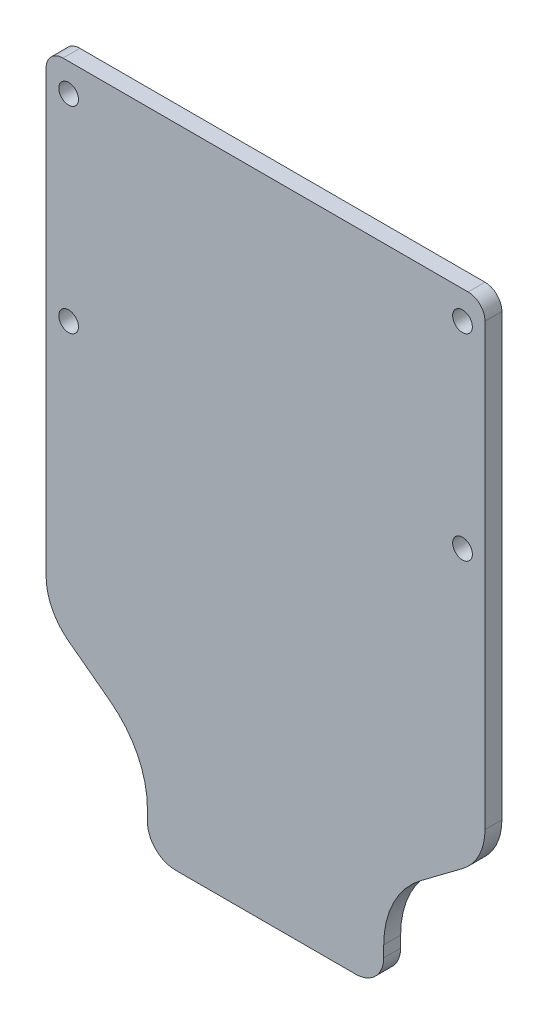
ISO-10303-21;
HEADER;
FILE_DESCRIPTION(('STEP AP214'),'2;1');
FILE_NAME('part.step','',(''),(''),'','','');
FILE_SCHEMA(('AUTOMOTIVE_DESIGN { 1 0 10303 214 1 1 1 1 }'));
ENDSEC;
DATA;
#1=APPLICATION_CONTEXT('core data for automotive mechanical design processes');
#2=APPLICATION_PROTOCOL_DEFINITION('international standard','automotive_design',2000,#1);
#3=PRODUCT_CONTEXT('',#1,'mechanical');
#4=PRODUCT('Part','Part','',(#3));
#5=PRODUCT_RELATED_PRODUCT_CATEGORY('part','',(#4));
#6=PRODUCT_DEFINITION_FORMATION('','',#4);
#7=PRODUCT_DEFINITION_CONTEXT('part definition',#1,'design');
#8=PRODUCT_DEFINITION('design','',#6,#7);
#9=PRODUCT_DEFINITION_SHAPE('','',#8);
#10=(LENGTH_UNIT() NAMED_UNIT(*) SI_UNIT(.MILLI.,.METRE.));
#11=(NAMED_UNIT(*) PLANE_ANGLE_UNIT() SI_UNIT($,.RADIAN.));
#12=(NAMED_UNIT(*) SI_UNIT($,.STERADIAN.) SOLID_ANGLE_UNIT());
#13=UNCERTAINTY_MEASURE_WITH_UNIT(LENGTH_MEASURE(1.E-05),#10,'distance_accuracy_value','');
#14=(GEOMETRIC_REPRESENTATION_CONTEXT(3) GLOBAL_UNCERTAINTY_ASSIGNED_CONTEXT((#13)) GLOBAL_UNIT_ASSIGNED_CONTEXT((#10,
#11,#12)) REPRESENTATION_CONTEXT('',''));
#15=CARTESIAN_POINT('',(0.,0.,0.));
#16=DIRECTION('',(0.,0.,1.));
#17=DIRECTION('',(1.,0.,0.));
#18=AXIS2_PLACEMENT_3D('',#15,#16,#17);
#19=CARTESIAN_POINT('',(0.,0.,3.));
#20=DIRECTION('',(0.,0.,1.));
#21=DIRECTION('',(1.,0.,0.));
#22=AXIS2_PLACEMENT_3D('',#19,#20,#21);
#23=PLANE('',#22);
#24=DIRECTION('',(0.,1.,0.));
#25=VECTOR('',#24,1.);
#26=CARTESIAN_POINT('',(39.,-22.5,3.));
#27=LINE('',#26,#25);
#28=CARTESIAN_POINT('',(39.,-58.7499999999953,3.));
#29=VERTEX_POINT('',#28);
#30=CARTESIAN_POINT('',(39.,19.5,3.));
#31=VERTEX_POINT('',#30);
#32=EDGE_CURVE('E241',#29,#31,#27,.T.);
#33=ORIENTED_EDGE('',*,*,#32,.T.);
#34=CARTESIAN_POINT('',(36.,19.5,3.));
#35=DIRECTION('',(0.,0.,1.));
#36=DIRECTION('',(1.,0.,0.));
#37=AXIS2_PLACEMENT_3D('',#34,#35,#36);
#38=CIRCLE('',#37,3.);
#39=CARTESIAN_POINT('',(36.,22.5,3.));
#40=VERTEX_POINT('',#39);
#41=EDGE_CURVE('E50',#31,#40,#38,.T.);
#42=ORIENTED_EDGE('',*,*,#41,.T.);
#43=DIRECTION('',(-1.,0.,0.));
#44=VECTOR('',#43,1.);
#45=CARTESIAN_POINT('',(39.,22.5,3.));
#46=LINE('',#45,#44);
#47=CARTESIAN_POINT('',(-36.,22.5,3.));
#48=VERTEX_POINT('',#47);
#49=EDGE_CURVE('E249',#40,#48,#46,.T.);
#50=ORIENTED_EDGE('',*,*,#49,.T.);
#51=CARTESIAN_POINT('',(-36.,19.5,3.));
#52=DIRECTION('',(0.,0.,1.));
#53=DIRECTION('',(1.,0.,0.));
#54=AXIS2_PLACEMENT_3D('',#51,#52,#53);
#55=CIRCLE('',#54,3.);
#56=CARTESIAN_POINT('',(-39.,19.5,3.));
#57=VERTEX_POINT('',#56);
#58=EDGE_CURVE('E53',#48,#57,#55,.T.);
#59=ORIENTED_EDGE('',*,*,#58,.T.);
#60=DIRECTION('',(0.,-1.,0.));
#61=VECTOR('',#60,1.);
#62=CARTESIAN_POINT('',(-39.,-22.5,3.));
#63=LINE('',#62,#61);
#64=CARTESIAN_POINT('',(-39.,-58.749999999995,3.));
#65=VERTEX_POINT('',#64);
#66=EDGE_CURVE('E242',#57,#65,#63,.T.);
#67=ORIENTED_EDGE('',*,*,#66,.T.);
#68=CARTESIAN_POINT('',(-29.,-58.749999999995,3.));
#69=DIRECTION('',(0.,0.,1.));
#70=DIRECTION('',(1.,0.,0.));
#71=AXIS2_PLACEMENT_3D('',#68,#69,#70);
#72=CIRCLE('',#71,10.);
#73=CARTESIAN_POINT('',(-35.,-66.749999999995,3.));
#74=VERTEX_POINT('',#73);
#75=EDGE_CURVE('E284',#65,#74,#72,.T.);
#76=ORIENTED_EDGE('',*,*,#75,.T.);
#77=DIRECTION('',(-0.799999999999999,0.600000000000001,0.));
#78=VECTOR('',#77,1.);
#79=CARTESIAN_POINT('',(-35.6,-66.299999999995,3.));
#80=LINE('',#79,#78);
#81=CARTESIAN_POINT('',(-27.6,-72.299999999995,3.));
#82=VERTEX_POINT('',#81);
#83=EDGE_CURVE('E170',#82,#74,#80,.T.);
#84=ORIENTED_EDGE('',*,*,#83,.F.);
#85=CARTESIAN_POINT('',(-37.5,-85.499999999995,3.));
#86=DIRECTION('',(0.,0.,1.));
#87=DIRECTION('',(1.,0.,0.));
#88=AXIS2_PLACEMENT_3D('',#85,#86,#87);
#89=CIRCLE('',#88,16.5);
#90=CARTESIAN_POINT('',(-21.,-85.4999999999951,3.));
#91=VERTEX_POINT('',#90);
#92=EDGE_CURVE('E203',#91,#82,#89,.T.);
#93=ORIENTED_EDGE('',*,*,#92,.F.);
#94=DIRECTION('',(0.,1.,0.));
#95=VECTOR('',#94,1.);
#96=CARTESIAN_POINT('',(-21.,-85.4999999999951,3.));
#97=LINE('',#96,#95);
#98=CARTESIAN_POINT('',(-21.,-87.5,3.));
#99=VERTEX_POINT('',#98);
#100=EDGE_CURVE('E200',#99,#91,#97,.T.);
#101=ORIENTED_EDGE('',*,*,#100,.F.);
#102=CARTESIAN_POINT('',(-16.,-87.5,3.));
#103=DIRECTION('',(0.,0.,1.));
#104=DIRECTION('',(1.,0.,0.));
#105=AXIS2_PLACEMENT_3D('',#102,#103,#104);
#106=CIRCLE('',#105,5.);
#107=CARTESIAN_POINT('',(-16.,-92.5,3.));
#108=VERTEX_POINT('',#107);
#109=EDGE_CURVE('E266',#99,#108,#106,.T.);
#110=ORIENTED_EDGE('',*,*,#109,.T.);
#111=DIRECTION('',(-1.,0.,0.));
#112=VECTOR('',#111,1.);
#113=CARTESIAN_POINT('',(39.,-92.5,3.));
#114=LINE('',#113,#112);
#115=CARTESIAN_POINT('',(16.,-92.5,3.));
#116=VERTEX_POINT('',#115);
#117=EDGE_CURVE('E214',#116,#108,#114,.T.);
#118=ORIENTED_EDGE('',*,*,#117,.F.);
#119=CARTESIAN_POINT('',(16.,-87.5,3.));
#120=DIRECTION('',(0.,0.,1.));
#121=DIRECTION('',(1.,0.,0.));
#122=AXIS2_PLACEMENT_3D('',#119,#120,#121);
#123=CIRCLE('',#122,5.);
#124=CARTESIAN_POINT('',(21.,-87.5,3.));
#125=VERTEX_POINT('',#124);
#126=EDGE_CURVE('E268',#116,#125,#123,.T.);
#127=ORIENTED_EDGE('',*,*,#126,.T.);
#128=DIRECTION('',(0.,-1.,0.));
#129=VECTOR('',#128,1.);
#130=CARTESIAN_POINT('',(20.9999999999999,-100.999999999995,3.));
#131=LINE('',#130,#129);
#132=CARTESIAN_POINT('',(21.,-85.4999999999952,3.));
#133=VERTEX_POINT('',#132);
#134=EDGE_CURVE('E198',#133,#125,#131,.T.);
#135=ORIENTED_EDGE('',*,*,#134,.F.);
#136=CARTESIAN_POINT('',(37.5,-85.4999999999953,3.));
#137=DIRECTION('',(0.,0.,1.));
#138=DIRECTION('',(1.,0.,0.));
#139=AXIS2_PLACEMENT_3D('',#136,#137,#138);
#140=CIRCLE('',#139,16.5);
#141=CARTESIAN_POINT('',(27.6,-72.2999999999952,3.));
#142=VERTEX_POINT('',#141);
#143=EDGE_CURVE('E191',#142,#133,#140,.T.);
#144=ORIENTED_EDGE('',*,*,#143,.F.);
#145=DIRECTION('',(-0.800000000000001,-0.599999999999998,0.));
#146=VECTOR('',#145,1.);
#147=CARTESIAN_POINT('',(27.6,-72.2999999999952,3.));
#148=LINE('',#147,#146);
#149=CARTESIAN_POINT('',(35.,-66.7499999999953,3.));
#150=VERTEX_POINT('',#149);
#151=EDGE_CURVE('E172',#150,#142,#148,.T.);
#152=ORIENTED_EDGE('',*,*,#151,.F.);
#153=CARTESIAN_POINT('',(29.,-58.7499999999953,3.));
#154=DIRECTION('',(0.,0.,1.));
#155=DIRECTION('',(1.,0.,0.));
#156=AXIS2_PLACEMENT_3D('',#153,#154,#155);
#157=CIRCLE('',#156,10.);
#158=EDGE_CURVE('E285',#150,#29,#157,.T.);
#159=ORIENTED_EDGE('',*,*,#158,.T.);
#160=EDGE_LOOP('',(#33,#42,#50,#59,#67,#76,#84,#93,#101,#110,#118,#127,#135,#144,#152,#159));
#161=FACE_BOUND('',#160,.T.);
#162=CARTESIAN_POINT('',(35.,-17.5,3.));
#163=DIRECTION('',(0.,0.,1.));
#164=DIRECTION('',(1.,0.,0.));
#165=AXIS2_PLACEMENT_3D('',#162,#163,#164);
#166=CIRCLE('',#165,1.75);
#167=CARTESIAN_POINT('',(36.75,-17.5,3.));
#168=VERTEX_POINT('',#167);
#169=EDGE_CURVE('E223',#168,#168,#166,.T.);
#170=ORIENTED_EDGE('',*,*,#169,.F.);
#171=EDGE_LOOP('',(#170));
#172=FACE_BOUND('',#171,.T.);
#173=CARTESIAN_POINT('',(-35.,17.5,3.));
#174=DIRECTION('',(0.,0.,1.));
#175=DIRECTION('',(1.,0.,0.));
#176=AXIS2_PLACEMENT_3D('',#173,#174,#175);
#177=CIRCLE('',#176,1.75);
#178=CARTESIAN_POINT('',(-33.25,17.5,3.));
#179=VERTEX_POINT('',#178);
#180=EDGE_CURVE('E240',#179,#179,#177,.T.);
#181=ORIENTED_EDGE('',*,*,#180,.F.);
#182=EDGE_LOOP('',(#181));
#183=FACE_BOUND('',#182,.T.);
#184=CARTESIAN_POINT('',(35.,17.5,3.));
#185=DIRECTION('',(0.,0.,1.));
#186=DIRECTION('',(1.,0.,0.));
#187=AXIS2_PLACEMENT_3D('',#184,#185,#186);
#188=CIRCLE('',#187,1.75);
#189=CARTESIAN_POINT('',(36.75,17.5,3.));
#190=VERTEX_POINT('',#189);
#191=EDGE_CURVE('E232',#190,#190,#188,.T.);
#192=ORIENTED_EDGE('',*,*,#191,.F.);
#193=EDGE_LOOP('',(#192));
#194=FACE_BOUND('',#193,.T.);
#195=CARTESIAN_POINT('',(-35.,-17.5,3.));
#196=DIRECTION('',(0.,0.,1.));
#197=DIRECTION('',(1.,0.,0.));
#198=AXIS2_PLACEMENT_3D('',#195,#196,#197);
#199=CIRCLE('',#198,1.75);
#200=CARTESIAN_POINT('',(-33.25,-17.5,3.));
#201=VERTEX_POINT('',#200);
#202=EDGE_CURVE('E218',#201,#201,#199,.T.);
#203=ORIENTED_EDGE('',*,*,#202,.F.);
#204=EDGE_LOOP('',(#203));
#205=FACE_BOUND('',#204,.T.);
#206=ADVANCED_FACE('F39',(#161,#172,#183,#194,#205),#23,.T.);
#207=CARTESIAN_POINT('',(0.,0.,0.));
#208=DIRECTION('',(0.,0.,1.));
#209=DIRECTION('',(1.,0.,0.));
#210=AXIS2_PLACEMENT_3D('',#207,#208,#209);
#211=PLANE('',#210);
#212=DIRECTION('',(-1.,0.,0.));
#213=VECTOR('',#212,1.);
#214=CARTESIAN_POINT('',(39.,22.5,0.));
#215=LINE('',#214,#213);
#216=CARTESIAN_POINT('',(36.,22.5,0.));
#217=VERTEX_POINT('',#216);
#218=CARTESIAN_POINT('',(-36.,22.5,0.));
#219=VERTEX_POINT('',#218);
#220=EDGE_CURVE('E247',#217,#219,#215,.T.);
#221=ORIENTED_EDGE('',*,*,#220,.F.);
#222=CARTESIAN_POINT('',(36.,19.5,0.));
#223=DIRECTION('',(0.,0.,1.));
#224=DIRECTION('',(1.,0.,0.));
#225=AXIS2_PLACEMENT_3D('',#222,#223,#224);
#226=CIRCLE('',#225,3.);
#227=CARTESIAN_POINT('',(39.,19.5,0.));
#228=VERTEX_POINT('',#227);
#229=EDGE_CURVE('E297',#217,#228,#226,.F.);
#230=ORIENTED_EDGE('',*,*,#229,.T.);
#231=DIRECTION('',(0.,1.,0.));
#232=VECTOR('',#231,1.);
#233=CARTESIAN_POINT('',(39.,-22.5,0.));
#234=LINE('',#233,#232);
#235=CARTESIAN_POINT('',(39.,-58.7499999999953,0.));
#236=VERTEX_POINT('',#235);
#237=EDGE_CURVE('E252',#236,#228,#234,.T.);
#238=ORIENTED_EDGE('',*,*,#237,.F.);
#239=CARTESIAN_POINT('',(29.,-58.7499999999953,0.));
#240=DIRECTION('',(0.,0.,1.));
#241=DIRECTION('',(1.,0.,0.));
#242=AXIS2_PLACEMENT_3D('',#239,#240,#241);
#243=CIRCLE('',#242,10.);
#244=CARTESIAN_POINT('',(35.,-66.7499999999953,0.));
#245=VERTEX_POINT('',#244);
#246=EDGE_CURVE('E163',#236,#245,#243,.F.);
#247=ORIENTED_EDGE('',*,*,#246,.T.);
#248=DIRECTION('',(-0.800000000000001,-0.599999999999998,0.));
#249=VECTOR('',#248,1.);
#250=CARTESIAN_POINT('',(27.6,-72.2999999999952,0.));
#251=LINE('',#250,#249);
#252=CARTESIAN_POINT('',(27.6,-72.2999999999952,0.));
#253=VERTEX_POINT('',#252);
#254=EDGE_CURVE('E154',#245,#253,#251,.T.);
#255=ORIENTED_EDGE('',*,*,#254,.T.);
#256=CARTESIAN_POINT('',(37.5,-85.4999999999953,0.));
#257=DIRECTION('',(0.,0.,1.));
#258=DIRECTION('',(1.,0.,0.));
#259=AXIS2_PLACEMENT_3D('',#256,#257,#258);
#260=CIRCLE('',#259,16.5);
#261=CARTESIAN_POINT('',(21.,-85.4999999999952,0.));
#262=VERTEX_POINT('',#261);
#263=EDGE_CURVE('E165',#253,#262,#260,.T.);
#264=ORIENTED_EDGE('',*,*,#263,.T.);
#265=DIRECTION('',(0.,-1.,0.));
#266=VECTOR('',#265,1.);
#267=CARTESIAN_POINT('',(20.9999999999999,-100.999999999995,0.));
#268=LINE('',#267,#266);
#269=CARTESIAN_POINT('',(21.,-87.5,0.));
#270=VERTEX_POINT('',#269);
#271=EDGE_CURVE('E185',#262,#270,#268,.T.);
#272=ORIENTED_EDGE('',*,*,#271,.T.);
#273=CARTESIAN_POINT('',(16.,-87.5,0.));
#274=DIRECTION('',(0.,0.,1.));
#275=DIRECTION('',(1.,0.,0.));
#276=AXIS2_PLACEMENT_3D('',#273,#274,#275);
#277=CIRCLE('',#276,5.);
#278=CARTESIAN_POINT('',(16.,-92.5,0.));
#279=VERTEX_POINT('',#278);
#280=EDGE_CURVE('E257',#270,#279,#277,.F.);
#281=ORIENTED_EDGE('',*,*,#280,.T.);
#282=DIRECTION('',(1.,0.,0.));
#283=VECTOR('',#282,1.);
#284=CARTESIAN_POINT('',(-39.,-92.5,0.));
#285=LINE('',#284,#283);
#286=CARTESIAN_POINT('',(-16.,-92.5,0.));
#287=VERTEX_POINT('',#286);
#288=EDGE_CURVE('E208',#287,#279,#285,.T.);
#289=ORIENTED_EDGE('',*,*,#288,.F.);
#290=CARTESIAN_POINT('',(-16.,-87.5,0.));
#291=DIRECTION('',(0.,0.,1.));
#292=DIRECTION('',(1.,0.,0.));
#293=AXIS2_PLACEMENT_3D('',#290,#291,#292);
#294=CIRCLE('',#293,5.);
#295=CARTESIAN_POINT('',(-21.,-87.5,0.));
#296=VERTEX_POINT('',#295);
#297=EDGE_CURVE('E256',#287,#296,#294,.F.);
#298=ORIENTED_EDGE('',*,*,#297,.T.);
#299=DIRECTION('',(0.,1.,0.));
#300=VECTOR('',#299,1.);
#301=CARTESIAN_POINT('',(-21.,-85.4999999999951,0.));
#302=LINE('',#301,#300);
#303=CARTESIAN_POINT('',(-21.,-85.4999999999951,0.));
#304=VERTEX_POINT('',#303);
#305=EDGE_CURVE('E184',#296,#304,#302,.T.);
#306=ORIENTED_EDGE('',*,*,#305,.T.);
#307=CARTESIAN_POINT('',(-37.5,-85.499999999995,0.));
#308=DIRECTION('',(0.,0.,1.));
#309=DIRECTION('',(1.,0.,0.));
#310=AXIS2_PLACEMENT_3D('',#307,#308,#309);
#311=CIRCLE('',#310,16.5);
#312=CARTESIAN_POINT('',(-27.6,-72.299999999995,0.));
#313=VERTEX_POINT('',#312);
#314=EDGE_CURVE('E187',#304,#313,#311,.T.);
#315=ORIENTED_EDGE('',*,*,#314,.T.);
#316=DIRECTION('',(-0.799999999999999,0.600000000000001,0.));
#317=VECTOR('',#316,1.);
#318=CARTESIAN_POINT('',(-35.6,-66.299999999995,0.));
#319=LINE('',#318,#317);
#320=CARTESIAN_POINT('',(-35.,-66.749999999995,0.));
#321=VERTEX_POINT('',#320);
#322=EDGE_CURVE('E179',#313,#321,#319,.T.);
#323=ORIENTED_EDGE('',*,*,#322,.T.);
#324=CARTESIAN_POINT('',(-29.,-58.749999999995,0.));
#325=DIRECTION('',(0.,0.,1.));
#326=DIRECTION('',(1.,0.,0.));
#327=AXIS2_PLACEMENT_3D('',#324,#325,#326);
#328=CIRCLE('',#327,10.);
#329=CARTESIAN_POINT('',(-39.,-58.749999999995,0.));
#330=VERTEX_POINT('',#329);
#331=EDGE_CURVE('E277',#321,#330,#328,.F.);
#332=ORIENTED_EDGE('',*,*,#331,.T.);
#333=DIRECTION('',(0.,-1.,0.));
#334=VECTOR('',#333,1.);
#335=CARTESIAN_POINT('',(-39.,-22.5,0.));
#336=LINE('',#335,#334);
#337=CARTESIAN_POINT('',(-39.,19.5,0.));
#338=VERTEX_POINT('',#337);
#339=EDGE_CURVE('E238',#338,#330,#336,.T.);
#340=ORIENTED_EDGE('',*,*,#339,.F.);
#341=CARTESIAN_POINT('',(-36.,19.5,0.));
#342=DIRECTION('',(0.,0.,1.));
#343=DIRECTION('',(1.,0.,0.));
#344=AXIS2_PLACEMENT_3D('',#341,#342,#343);
#345=CIRCLE('',#344,3.);
#346=EDGE_CURVE('E298',#338,#219,#345,.F.);
#347=ORIENTED_EDGE('',*,*,#346,.T.);
#348=EDGE_LOOP('',(#221,#230,#238,#247,#255,#264,#272,#281,#289,#298,#306,#315,#323,#332,#340,#347));
#349=FACE_BOUND('',#348,.T.);
#350=CARTESIAN_POINT('',(-35.,17.5,0.));
#351=DIRECTION('',(0.,0.,1.));
#352=DIRECTION('',(1.,0.,0.));
#353=AXIS2_PLACEMENT_3D('',#350,#351,#352);
#354=CIRCLE('',#353,1.75);
#355=CARTESIAN_POINT('',(-33.25,17.5,0.));
#356=VERTEX_POINT('',#355);
#357=EDGE_CURVE('E231',#356,#356,#354,.T.);
#358=ORIENTED_EDGE('',*,*,#357,.T.);
#359=EDGE_LOOP('',(#358));
#360=FACE_BOUND('',#359,.T.);
#361=CARTESIAN_POINT('',(35.,17.5,0.));
#362=DIRECTION('',(0.,0.,1.));
#363=DIRECTION('',(1.,0.,0.));
#364=AXIS2_PLACEMENT_3D('',#361,#362,#363);
#365=CIRCLE('',#364,1.75);
#366=CARTESIAN_POINT('',(36.75,17.5,0.));
#367=VERTEX_POINT('',#366);
#368=EDGE_CURVE('E227',#367,#367,#365,.T.);
#369=ORIENTED_EDGE('',*,*,#368,.T.);
#370=EDGE_LOOP('',(#369));
#371=FACE_BOUND('',#370,.T.);
#372=CARTESIAN_POINT('',(35.,-17.5,0.));
#373=DIRECTION('',(0.,0.,1.));
#374=DIRECTION('',(1.,0.,0.));
#375=AXIS2_PLACEMENT_3D('',#372,#373,#374);
#376=CIRCLE('',#375,1.75);
#377=CARTESIAN_POINT('',(36.75,-17.5,0.));
#378=VERTEX_POINT('',#377);
#379=EDGE_CURVE('E225',#378,#378,#376,.T.);
#380=ORIENTED_EDGE('',*,*,#379,.T.);
#381=EDGE_LOOP('',(#380));
#382=FACE_BOUND('',#381,.T.);
#383=CARTESIAN_POINT('',(-35.,-17.5,0.));
#384=DIRECTION('',(0.,0.,1.));
#385=DIRECTION('',(1.,0.,0.));
#386=AXIS2_PLACEMENT_3D('',#383,#384,#385);
#387=CIRCLE('',#386,1.75);
#388=CARTESIAN_POINT('',(-33.25,-17.5,0.));
#389=VERTEX_POINT('',#388);
#390=EDGE_CURVE('E217',#389,#389,#387,.T.);
#391=ORIENTED_EDGE('',*,*,#390,.T.);
#392=EDGE_LOOP('',(#391));
#393=FACE_BOUND('',#392,.T.);
#394=ADVANCED_FACE('F158',(#349,#360,#371,#382,#393),#211,.F.);
#395=CARTESIAN_POINT('',(-39.,-22.5,3.));
#396=DIRECTION('',(1.,0.,0.));
#397=DIRECTION('',(0.,1.,0.));
#398=AXIS2_PLACEMENT_3D('',#395,#396,#397);
#399=PLANE('',#398);
#400=ORIENTED_EDGE('',*,*,#66,.F.);
#401=DIRECTION('',(0.,0.,-1.));
#402=VECTOR('',#401,1.);
#403=CARTESIAN_POINT('',(-39.,19.5,3.));
#404=LINE('',#403,#402);
#405=EDGE_CURVE('E11',#57,#338,#404,.T.);
#406=ORIENTED_EDGE('',*,*,#405,.T.);
#407=ORIENTED_EDGE('',*,*,#339,.T.);
#408=DIRECTION('',(0.,0.,1.));
#409=VECTOR('',#408,1.);
#410=CARTESIAN_POINT('',(-39.,-58.749999999995,3.));
#411=LINE('',#410,#409);
#412=EDGE_CURVE('E287',#330,#65,#411,.T.);
#413=ORIENTED_EDGE('',*,*,#412,.T.);
#414=EDGE_LOOP('',(#400,#406,#407,#413));
#415=FACE_BOUND('',#414,.T.);
#416=ADVANCED_FACE('F353',(#415),#399,.F.);
#417=CARTESIAN_POINT('',(39.,-22.5,3.));
#418=DIRECTION('',(-1.,0.,0.));
#419=DIRECTION('',(0.,0.,1.));
#420=AXIS2_PLACEMENT_3D('',#417,#418,#419);
#421=PLANE('',#420);
#422=ORIENTED_EDGE('',*,*,#237,.T.);
#423=DIRECTION('',(0.,0.,-1.));
#424=VECTOR('',#423,1.);
#425=CARTESIAN_POINT('',(39.,19.5,3.));
#426=LINE('',#425,#424);
#427=EDGE_CURVE('E64',#228,#31,#426,.F.);
#428=ORIENTED_EDGE('',*,*,#427,.T.);
#429=ORIENTED_EDGE('',*,*,#32,.F.);
#430=DIRECTION('',(0.,0.,-1.));
#431=VECTOR('',#430,1.);
#432=CARTESIAN_POINT('',(39.,-58.7499999999953,3.));
#433=LINE('',#432,#431);
#434=EDGE_CURVE('E272',#29,#236,#433,.T.);
#435=ORIENTED_EDGE('',*,*,#434,.T.);
#436=EDGE_LOOP('',(#422,#428,#429,#435));
#437=FACE_BOUND('',#436,.T.);
#438=ADVANCED_FACE('F309',(#437),#421,.F.);
#439=CARTESIAN_POINT('',(39.,22.5,3.));
#440=DIRECTION('',(0.,-1.,0.));
#441=DIRECTION('',(1.,0.,0.));
#442=AXIS2_PLACEMENT_3D('',#439,#440,#441);
#443=PLANE('',#442);
#444=ORIENTED_EDGE('',*,*,#49,.F.);
#445=DIRECTION('',(0.,0.,-1.));
#446=VECTOR('',#445,1.);
#447=CARTESIAN_POINT('',(36.,22.5,3.));
#448=LINE('',#447,#446);
#449=EDGE_CURVE('E291',#40,#217,#448,.T.);
#450=ORIENTED_EDGE('',*,*,#449,.T.);
#451=ORIENTED_EDGE('',*,*,#220,.T.);
#452=DIRECTION('',(0.,0.,-1.));
#453=VECTOR('',#452,1.);
#454=CARTESIAN_POINT('',(-36.,22.5,3.));
#455=LINE('',#454,#453);
#456=EDGE_CURVE('E292',#219,#48,#455,.F.);
#457=ORIENTED_EDGE('',*,*,#456,.T.);
#458=EDGE_LOOP('',(#444,#450,#451,#457));
#459=FACE_BOUND('',#458,.T.);
#460=ADVANCED_FACE('F307',(#459),#443,.F.);
#461=CARTESIAN_POINT('',(-35.,17.5,3.));
#462=DIRECTION('',(0.,0.,-1.));
#463=DIRECTION('',(-1.,0.,0.));
#464=AXIS2_PLACEMENT_3D('',#461,#462,#463);
#465=CYLINDRICAL_SURFACE('',#464,1.75);
#466=ORIENTED_EDGE('',*,*,#180,.T.);
#467=EDGE_LOOP('',(#466));
#468=FACE_BOUND('',#467,.T.);
#469=ORIENTED_EDGE('',*,*,#357,.F.);
#470=EDGE_LOOP('',(#469));
#471=FACE_BOUND('',#470,.T.);
#472=ADVANCED_FACE('F368',(#468,#471),#465,.F.);
#473=CARTESIAN_POINT('',(35.,17.5,3.));
#474=DIRECTION('',(0.,0.,-1.));
#475=DIRECTION('',(-1.,0.,0.));
#476=AXIS2_PLACEMENT_3D('',#473,#474,#475);
#477=CYLINDRICAL_SURFACE('',#476,1.75);
#478=ORIENTED_EDGE('',*,*,#191,.T.);
#479=EDGE_LOOP('',(#478));
#480=FACE_BOUND('',#479,.T.);
#481=ORIENTED_EDGE('',*,*,#368,.F.);
#482=EDGE_LOOP('',(#481));
#483=FACE_BOUND('',#482,.T.);
#484=ADVANCED_FACE('F470',(#480,#483),#477,.F.);
#485=CARTESIAN_POINT('',(35.,-17.5,3.));
#486=DIRECTION('',(0.,0.,-1.));
#487=DIRECTION('',(-1.,0.,0.));
#488=AXIS2_PLACEMENT_3D('',#485,#486,#487);
#489=CYLINDRICAL_SURFACE('',#488,1.75);
#490=ORIENTED_EDGE('',*,*,#169,.T.);
#491=EDGE_LOOP('',(#490));
#492=FACE_BOUND('',#491,.T.);
#493=ORIENTED_EDGE('',*,*,#379,.F.);
#494=EDGE_LOOP('',(#493));
#495=FACE_BOUND('',#494,.T.);
#496=ADVANCED_FACE('F456',(#492,#495),#489,.F.);
#497=CARTESIAN_POINT('',(-35.,-17.5,3.));
#498=DIRECTION('',(0.,0.,-1.));
#499=DIRECTION('',(-1.,0.,0.));
#500=AXIS2_PLACEMENT_3D('',#497,#498,#499);
#501=CYLINDRICAL_SURFACE('',#500,1.75);
#502=ORIENTED_EDGE('',*,*,#202,.T.);
#503=EDGE_LOOP('',(#502));
#504=FACE_BOUND('',#503,.T.);
#505=ORIENTED_EDGE('',*,*,#390,.F.);
#506=EDGE_LOOP('',(#505));
#507=FACE_BOUND('',#506,.T.);
#508=ADVANCED_FACE('F440',(#504,#507),#501,.F.);
#509=CARTESIAN_POINT('',(0.,-92.5,0.));
#510=DIRECTION('',(0.,-1.,0.));
#511=DIRECTION('',(1.,0.,0.));
#512=AXIS2_PLACEMENT_3D('',#509,#510,#511);
#513=PLANE('',#512);
#514=ORIENTED_EDGE('',*,*,#288,.T.);
#515=DIRECTION('',(0.,0.,-1.));
#516=VECTOR('',#515,1.);
#517=CARTESIAN_POINT('',(16.,-92.5,3.));
#518=LINE('',#517,#516);
#519=EDGE_CURVE('E262',#279,#116,#518,.F.);
#520=ORIENTED_EDGE('',*,*,#519,.T.);
#521=ORIENTED_EDGE('',*,*,#117,.T.);
#522=DIRECTION('',(0.,0.,1.));
#523=VECTOR('',#522,1.);
#524=CARTESIAN_POINT('',(-16.,-92.5,0.));
#525=LINE('',#524,#523);
#526=EDGE_CURVE('E265',#108,#287,#525,.F.);
#527=ORIENTED_EDGE('',*,*,#526,.T.);
#528=EDGE_LOOP('',(#514,#520,#521,#527));
#529=FACE_BOUND('',#528,.T.);
#530=ADVANCED_FACE('F330',(#529),#513,.T.);
#531=CARTESIAN_POINT('',(20.9999999999999,-100.999999999995,0.));
#532=DIRECTION('',(-1.,0.,0.));
#533=DIRECTION('',(0.,-1.,0.));
#534=AXIS2_PLACEMENT_3D('',#531,#532,#533);
#535=PLANE('',#534);
#536=ORIENTED_EDGE('',*,*,#134,.T.);
#537=DIRECTION('',(0.,0.,-1.));
#538=VECTOR('',#537,1.);
#539=CARTESIAN_POINT('',(21.,-87.5,0.));
#540=LINE('',#539,#538);
#541=EDGE_CURVE('E248',#125,#270,#540,.T.);
#542=ORIENTED_EDGE('',*,*,#541,.T.);
#543=ORIENTED_EDGE('',*,*,#271,.F.);
#544=DIRECTION('',(0.,0.,1.));
#545=VECTOR('',#544,1.);
#546=CARTESIAN_POINT('',(21.,-85.4999999999952,0.));
#547=LINE('',#546,#545);
#548=EDGE_CURVE('E180',#262,#133,#547,.T.);
#549=ORIENTED_EDGE('',*,*,#548,.T.);
#550=EDGE_LOOP('',(#536,#542,#543,#549));
#551=FACE_BOUND('',#550,.T.);
#552=ADVANCED_FACE('F319',(#551),#535,.F.);
#553=CARTESIAN_POINT('',(27.6,-72.2999999999952,0.));
#554=DIRECTION('',(-0.599999999999998,0.800000000000001,0.));
#555=DIRECTION('',(-0.800000000000001,-0.599999999999998,0.));
#556=AXIS2_PLACEMENT_3D('',#553,#554,#555);
#557=PLANE('',#556);
#558=ORIENTED_EDGE('',*,*,#254,.F.);
#559=DIRECTION('',(0.,0.,-1.));
#560=VECTOR('',#559,1.);
#561=CARTESIAN_POINT('',(35.,-66.7499999999953,0.));
#562=LINE('',#561,#560);
#563=EDGE_CURVE('E278',#245,#150,#562,.F.);
#564=ORIENTED_EDGE('',*,*,#563,.T.);
#565=ORIENTED_EDGE('',*,*,#151,.T.);
#566=DIRECTION('',(0.,0.,1.));
#567=VECTOR('',#566,1.);
#568=CARTESIAN_POINT('',(27.6,-72.2999999999952,0.));
#569=LINE('',#568,#567);
#570=EDGE_CURVE('E168',#253,#142,#569,.T.);
#571=ORIENTED_EDGE('',*,*,#570,.F.);
#572=EDGE_LOOP('',(#558,#564,#565,#571));
#573=FACE_BOUND('',#572,.T.);
#574=ADVANCED_FACE('F173',(#573),#557,.F.);
#575=CARTESIAN_POINT('',(37.5,-85.4999999999953,0.));
#576=DIRECTION('',(0.,0.,1.));
#577=DIRECTION('',(1.,0.,0.));
#578=AXIS2_PLACEMENT_3D('',#575,#576,#577);
#579=CYLINDRICAL_SURFACE('',#578,16.5);
#580=ORIENTED_EDGE('',*,*,#143,.T.);
#581=ORIENTED_EDGE('',*,*,#548,.F.);
#582=ORIENTED_EDGE('',*,*,#263,.F.);
#583=ORIENTED_EDGE('',*,*,#570,.T.);
#584=EDGE_LOOP('',(#580,#581,#582,#583));
#585=FACE_BOUND('',#584,.T.);
#586=ADVANCED_FACE('F178',(#585),#579,.F.);
#587=CARTESIAN_POINT('',(-35.6,-66.299999999995,0.));
#588=DIRECTION('',(0.600000000000001,0.799999999999999,0.));
#589=DIRECTION('',(-0.799999999999999,0.600000000000002,0.));
#590=AXIS2_PLACEMENT_3D('',#587,#588,#589);
#591=PLANE('',#590);
#592=ORIENTED_EDGE('',*,*,#83,.T.);
#593=DIRECTION('',(0.,0.,1.));
#594=VECTOR('',#593,1.);
#595=CARTESIAN_POINT('',(-35.,-66.749999999995,0.));
#596=LINE('',#595,#594);
#597=EDGE_CURVE('E286',#74,#321,#596,.F.);
#598=ORIENTED_EDGE('',*,*,#597,.T.);
#599=ORIENTED_EDGE('',*,*,#322,.F.);
#600=DIRECTION('',(0.,0.,1.));
#601=VECTOR('',#600,1.);
#602=CARTESIAN_POINT('',(-27.6,-72.299999999995,0.));
#603=LINE('',#602,#601);
#604=EDGE_CURVE('E206',#313,#82,#603,.T.);
#605=ORIENTED_EDGE('',*,*,#604,.T.);
#606=EDGE_LOOP('',(#592,#598,#599,#605));
#607=FACE_BOUND('',#606,.T.);
#608=ADVANCED_FACE('F395',(#607),#591,.F.);
#609=CARTESIAN_POINT('',(-37.5,-85.499999999995,0.));
#610=DIRECTION('',(0.,0.,1.));
#611=DIRECTION('',(1.,0.,0.));
#612=AXIS2_PLACEMENT_3D('',#609,#610,#611);
#613=CYLINDRICAL_SURFACE('',#612,16.5);
#614=ORIENTED_EDGE('',*,*,#92,.T.);
#615=ORIENTED_EDGE('',*,*,#604,.F.);
#616=ORIENTED_EDGE('',*,*,#314,.F.);
#617=DIRECTION('',(0.,0.,1.));
#618=VECTOR('',#617,1.);
#619=CARTESIAN_POINT('',(-21.,-85.4999999999951,0.));
#620=LINE('',#619,#618);
#621=EDGE_CURVE('E207',#304,#91,#620,.T.);
#622=ORIENTED_EDGE('',*,*,#621,.T.);
#623=EDGE_LOOP('',(#614,#615,#616,#622));
#624=FACE_BOUND('',#623,.T.);
#625=ADVANCED_FACE('F336',(#624),#613,.F.);
#626=CARTESIAN_POINT('',(-21.,-85.4999999999951,0.));
#627=DIRECTION('',(1.,0.,0.));
#628=DIRECTION('',(0.,1.,0.));
#629=AXIS2_PLACEMENT_3D('',#626,#627,#628);
#630=PLANE('',#629);
#631=ORIENTED_EDGE('',*,*,#305,.F.);
#632=DIRECTION('',(0.,0.,1.));
#633=VECTOR('',#632,1.);
#634=CARTESIAN_POINT('',(-21.,-87.5,3.));
#635=LINE('',#634,#633);
#636=EDGE_CURVE('E269',#296,#99,#635,.T.);
#637=ORIENTED_EDGE('',*,*,#636,.T.);
#638=ORIENTED_EDGE('',*,*,#100,.T.);
#639=ORIENTED_EDGE('',*,*,#621,.F.);
#640=EDGE_LOOP('',(#631,#637,#638,#639));
#641=FACE_BOUND('',#640,.T.);
#642=ADVANCED_FACE('F333',(#641),#630,.F.);
#643=CARTESIAN_POINT('',(16.,-87.5,0.));
#644=DIRECTION('',(0.,0.,1.));
#645=DIRECTION('',(1.,0.,0.));
#646=AXIS2_PLACEMENT_3D('',#643,#644,#645);
#647=CYLINDRICAL_SURFACE('',#646,5.);
#648=ORIENTED_EDGE('',*,*,#126,.F.);
#649=ORIENTED_EDGE('',*,*,#519,.F.);
#650=ORIENTED_EDGE('',*,*,#280,.F.);
#651=ORIENTED_EDGE('',*,*,#541,.F.);
#652=EDGE_LOOP('',(#648,#649,#650,#651));
#653=FACE_BOUND('',#652,.T.);
#654=ADVANCED_FACE('F325',(#653),#647,.T.);
#655=CARTESIAN_POINT('',(-16.,-87.5,0.));
#656=DIRECTION('',(0.,0.,-1.));
#657=DIRECTION('',(-1.,0.,0.));
#658=AXIS2_PLACEMENT_3D('',#655,#656,#657);
#659=CYLINDRICAL_SURFACE('',#658,5.);
#660=ORIENTED_EDGE('',*,*,#297,.F.);
#661=ORIENTED_EDGE('',*,*,#526,.F.);
#662=ORIENTED_EDGE('',*,*,#109,.F.);
#663=ORIENTED_EDGE('',*,*,#636,.F.);
#664=EDGE_LOOP('',(#660,#661,#662,#663));
#665=FACE_BOUND('',#664,.T.);
#666=ADVANCED_FACE('F329',(#665),#659,.T.);
#667=CARTESIAN_POINT('',(29.,-58.7499999999953,3.));
#668=DIRECTION('',(0.,0.,-1.));
#669=DIRECTION('',(-1.,0.,0.));
#670=AXIS2_PLACEMENT_3D('',#667,#668,#669);
#671=CYLINDRICAL_SURFACE('',#670,10.);
#672=ORIENTED_EDGE('',*,*,#158,.F.);
#673=ORIENTED_EDGE('',*,*,#563,.F.);
#674=ORIENTED_EDGE('',*,*,#246,.F.);
#675=ORIENTED_EDGE('',*,*,#434,.F.);
#676=EDGE_LOOP('',(#672,#673,#674,#675));
#677=FACE_BOUND('',#676,.T.);
#678=ADVANCED_FACE('F314',(#677),#671,.T.);
#679=CARTESIAN_POINT('',(-29.,-58.749999999995,3.));
#680=DIRECTION('',(0.,0.,1.));
#681=DIRECTION('',(1.,0.,0.));
#682=AXIS2_PLACEMENT_3D('',#679,#680,#681);
#683=CYLINDRICAL_SURFACE('',#682,10.);
#684=ORIENTED_EDGE('',*,*,#331,.F.);
#685=ORIENTED_EDGE('',*,*,#597,.F.);
#686=ORIENTED_EDGE('',*,*,#75,.F.);
#687=ORIENTED_EDGE('',*,*,#412,.F.);
#688=EDGE_LOOP('',(#684,#685,#686,#687));
#689=FACE_BOUND('',#688,.T.);
#690=ADVANCED_FACE('F346',(#689),#683,.T.);
#691=CARTESIAN_POINT('',(36.,19.5,3.));
#692=DIRECTION('',(0.,0.,-1.));
#693=DIRECTION('',(-1.,0.,0.));
#694=AXIS2_PLACEMENT_3D('',#691,#692,#693);
#695=CYLINDRICAL_SURFACE('',#694,3.);
#696=ORIENTED_EDGE('',*,*,#41,.F.);
#697=ORIENTED_EDGE('',*,*,#427,.F.);
#698=ORIENTED_EDGE('',*,*,#229,.F.);
#699=ORIENTED_EDGE('',*,*,#449,.F.);
#700=EDGE_LOOP('',(#696,#697,#698,#699));
#701=FACE_BOUND('',#700,.T.);
#702=ADVANCED_FACE('F310',(#701),#695,.T.);
#703=CARTESIAN_POINT('',(-36.,19.5,3.));
#704=DIRECTION('',(0.,0.,-1.));
#705=DIRECTION('',(-1.,0.,0.));
#706=AXIS2_PLACEMENT_3D('',#703,#704,#705);
#707=CYLINDRICAL_SURFACE('',#706,3.);
#708=ORIENTED_EDGE('',*,*,#58,.F.);
#709=ORIENTED_EDGE('',*,*,#456,.F.);
#710=ORIENTED_EDGE('',*,*,#346,.F.);
#711=ORIENTED_EDGE('',*,*,#405,.F.);
#712=EDGE_LOOP('',(#708,#709,#710,#711));
#713=FACE_BOUND('',#712,.T.);
#714=ADVANCED_FACE('F41',(#713),#707,.T.);
#715=CLOSED_SHELL('',(#206,#394,#416,#438,#460,#472,#484,#496,#508,#530,#552,#574,#586,#608,
#625,#642,#654,#666,#678,#690,#702,#714));
#716=MANIFOLD_SOLID_BREP('B2',#715);
#717=ADVANCED_BREP_SHAPE_REPRESENTATION('',(#18,#716),#14);
#718=SHAPE_DEFINITION_REPRESENTATION(#9,#717);
ENDSEC;
END-ISO-10303-21;
